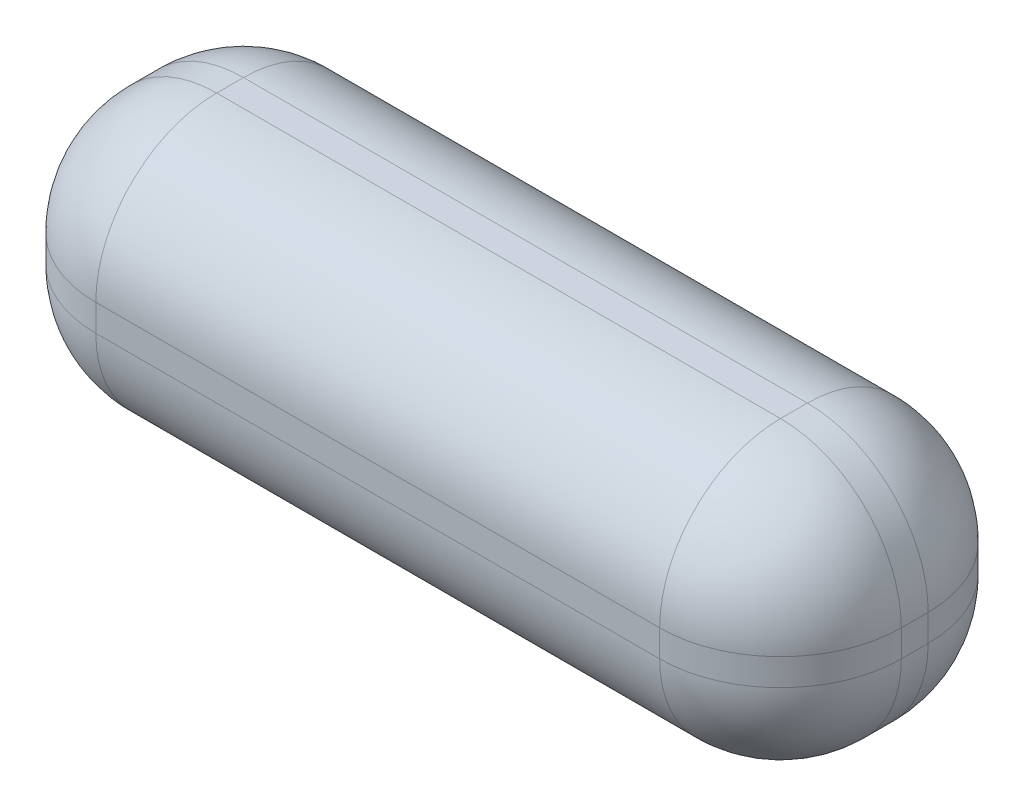
ISO-10303-21;
HEADER;
FILE_DESCRIPTION(('STEP AP214'),'2;1');
FILE_NAME('part.step','',(''),(''),'','','');
FILE_SCHEMA(('AUTOMOTIVE_DESIGN { 1 0 10303 214 1 1 1 1 }'));
ENDSEC;
DATA;
#1=APPLICATION_CONTEXT('core data for automotive mechanical design processes');
#2=APPLICATION_PROTOCOL_DEFINITION('international standard','automotive_design',2000,#1);
#3=PRODUCT_CONTEXT('',#1,'mechanical');
#4=PRODUCT('Part','Part','',(#3));
#5=PRODUCT_RELATED_PRODUCT_CATEGORY('part','',(#4));
#6=PRODUCT_DEFINITION_FORMATION('','',#4);
#7=PRODUCT_DEFINITION_CONTEXT('part definition',#1,'design');
#8=PRODUCT_DEFINITION('design','',#6,#7);
#9=PRODUCT_DEFINITION_SHAPE('','',#8);
#10=(LENGTH_UNIT() NAMED_UNIT(*) SI_UNIT(.MILLI.,.METRE.));
#11=(NAMED_UNIT(*) PLANE_ANGLE_UNIT() SI_UNIT($,.RADIAN.));
#12=(NAMED_UNIT(*) SI_UNIT($,.STERADIAN.) SOLID_ANGLE_UNIT());
#13=UNCERTAINTY_MEASURE_WITH_UNIT(LENGTH_MEASURE(1.E-05),#10,'distance_accuracy_value','');
#14=(GEOMETRIC_REPRESENTATION_CONTEXT(3) GLOBAL_UNCERTAINTY_ASSIGNED_CONTEXT((#13)) GLOBAL_UNIT_ASSIGNED_CONTEXT((#10,
#11,#12)) REPRESENTATION_CONTEXT('',''));
#15=CARTESIAN_POINT('',(0.,0.,0.));
#16=DIRECTION('',(0.,0.,1.));
#17=DIRECTION('',(1.,0.,0.));
#18=AXIS2_PLACEMENT_3D('',#15,#16,#17);
#19=CARTESIAN_POINT('',(-150.,-50.,50.));
#20=DIRECTION('',(1.,0.,0.));
#21=DIRECTION('',(0.,0.,-1.));
#22=AXIS2_PLACEMENT_3D('',#19,#20,#21);
#23=PLANE('',#22);
#24=DIRECTION('',(0.,-1.,0.));
#25=VECTOR('',#24,1.);
#26=CARTESIAN_POINT('',(-150.,-50.,-5.));
#27=LINE('',#26,#25);
#28=CARTESIAN_POINT('',(-150.,5.,-5.));
#29=VERTEX_POINT('',#28);
#30=CARTESIAN_POINT('',(-150.,-5.00000000000001,-5.));
#31=VERTEX_POINT('',#30);
#32=EDGE_CURVE('E186',#29,#31,#27,.T.);
#33=ORIENTED_EDGE('',*,*,#32,.T.);
#34=DIRECTION('',(0.,0.,-1.));
#35=VECTOR('',#34,1.);
#36=CARTESIAN_POINT('',(-150.,-5.00000000000001,50.));
#37=LINE('',#36,#35);
#38=CARTESIAN_POINT('',(-150.,-5.00000000000001,5.));
#39=VERTEX_POINT('',#38);
#40=EDGE_CURVE('E189',#31,#39,#37,.F.);
#41=ORIENTED_EDGE('',*,*,#40,.T.);
#42=DIRECTION('',(0.,-1.,0.));
#43=VECTOR('',#42,1.);
#44=CARTESIAN_POINT('',(-150.,50.,5.));
#45=LINE('',#44,#43);
#46=CARTESIAN_POINT('',(-150.,5.,5.));
#47=VERTEX_POINT('',#46);
#48=EDGE_CURVE('E183',#39,#47,#45,.F.);
#49=ORIENTED_EDGE('',*,*,#48,.T.);
#50=DIRECTION('',(0.,0.,-1.));
#51=VECTOR('',#50,1.);
#52=CARTESIAN_POINT('',(-150.,5.,50.));
#53=LINE('',#52,#51);
#54=EDGE_CURVE('E180',#47,#29,#53,.T.);
#55=ORIENTED_EDGE('',*,*,#54,.T.);
#56=EDGE_LOOP('',(#33,#41,#49,#55));
#57=FACE_BOUND('',#56,.T.);
#58=ADVANCED_FACE('F40',(#57),#23,.F.);
#59=CARTESIAN_POINT('',(150.,-50.,50.));
#60=DIRECTION('',(0.,1.,0.));
#61=DIRECTION('',(-1.,0.,0.));
#62=AXIS2_PLACEMENT_3D('',#59,#60,#61);
#63=PLANE('',#62);
#64=DIRECTION('',(1.,0.,0.));
#65=VECTOR('',#64,1.);
#66=CARTESIAN_POINT('',(-150.,-50.,5.));
#67=LINE('',#66,#65);
#68=CARTESIAN_POINT('',(105.,-50.,5.));
#69=VERTEX_POINT('',#68);
#70=CARTESIAN_POINT('',(-105.,-50.,5.));
#71=VERTEX_POINT('',#70);
#72=EDGE_CURVE('E133',#69,#71,#67,.F.);
#73=ORIENTED_EDGE('',*,*,#72,.T.);
#74=DIRECTION('',(0.,0.,-1.));
#75=VECTOR('',#74,1.);
#76=CARTESIAN_POINT('',(-105.,-50.,50.));
#77=LINE('',#76,#75);
#78=CARTESIAN_POINT('',(-105.,-50.,-5.));
#79=VERTEX_POINT('',#78);
#80=EDGE_CURVE('E177',#71,#79,#77,.T.);
#81=ORIENTED_EDGE('',*,*,#80,.T.);
#82=DIRECTION('',(1.,0.,0.));
#83=VECTOR('',#82,1.);
#84=CARTESIAN_POINT('',(150.,-50.,-5.));
#85=LINE('',#84,#83);
#86=CARTESIAN_POINT('',(105.,-50.,-5.));
#87=VERTEX_POINT('',#86);
#88=EDGE_CURVE('E136',#79,#87,#85,.T.);
#89=ORIENTED_EDGE('',*,*,#88,.T.);
#90=DIRECTION('',(0.,0.,-1.));
#91=VECTOR('',#90,1.);
#92=CARTESIAN_POINT('',(105.,-50.,50.));
#93=LINE('',#92,#91);
#94=EDGE_CURVE('E128',#87,#69,#93,.F.);
#95=ORIENTED_EDGE('',*,*,#94,.T.);
#96=EDGE_LOOP('',(#73,#81,#89,#95));
#97=FACE_BOUND('',#96,.T.);
#98=ADVANCED_FACE('F130',(#97),#63,.F.);
#99=CARTESIAN_POINT('',(150.,-50.,50.));
#100=DIRECTION('',(-1.,0.,0.));
#101=DIRECTION('',(0.,0.,1.));
#102=AXIS2_PLACEMENT_3D('',#99,#100,#101);
#103=PLANE('',#102);
#104=DIRECTION('',(0.,1.,0.));
#105=VECTOR('',#104,1.);
#106=CARTESIAN_POINT('',(150.,-50.,5.));
#107=LINE('',#106,#105);
#108=CARTESIAN_POINT('',(150.,5.00000000000001,5.));
#109=VERTEX_POINT('',#108);
#110=CARTESIAN_POINT('',(150.,-5.,5.));
#111=VERTEX_POINT('',#110);
#112=EDGE_CURVE('E209',#109,#111,#107,.F.);
#113=ORIENTED_EDGE('',*,*,#112,.T.);
#114=DIRECTION('',(0.,0.,-1.));
#115=VECTOR('',#114,1.);
#116=CARTESIAN_POINT('',(150.,-5.,50.));
#117=LINE('',#116,#115);
#118=CARTESIAN_POINT('',(150.,-5.,-5.));
#119=VERTEX_POINT('',#118);
#120=EDGE_CURVE('E148',#111,#119,#117,.T.);
#121=ORIENTED_EDGE('',*,*,#120,.T.);
#122=DIRECTION('',(0.,1.,0.));
#123=VECTOR('',#122,1.);
#124=CARTESIAN_POINT('',(150.,-50.,-5.));
#125=LINE('',#124,#123);
#126=CARTESIAN_POINT('',(150.,5.00000000000001,-5.));
#127=VERTEX_POINT('',#126);
#128=EDGE_CURVE('E212',#119,#127,#125,.T.);
#129=ORIENTED_EDGE('',*,*,#128,.T.);
#130=DIRECTION('',(0.,0.,-1.));
#131=VECTOR('',#130,1.);
#132=CARTESIAN_POINT('',(150.,5.00000000000001,50.));
#133=LINE('',#132,#131);
#134=EDGE_CURVE('E206',#127,#109,#133,.F.);
#135=ORIENTED_EDGE('',*,*,#134,.T.);
#136=EDGE_LOOP('',(#113,#121,#129,#135));
#137=FACE_BOUND('',#136,.T.);
#138=ADVANCED_FACE('F387',(#137),#103,.F.);
#139=CARTESIAN_POINT('',(150.,50.,50.));
#140=DIRECTION('',(0.,-1.,0.));
#141=DIRECTION('',(1.,0.,0.));
#142=AXIS2_PLACEMENT_3D('',#139,#140,#141);
#143=PLANE('',#142);
#144=DIRECTION('',(-1.,0.,0.));
#145=VECTOR('',#144,1.);
#146=CARTESIAN_POINT('',(150.,50.,5.));
#147=LINE('',#146,#145);
#148=CARTESIAN_POINT('',(-105.,50.,5.));
#149=VERTEX_POINT('',#148);
#150=CARTESIAN_POINT('',(105.,50.,5.));
#151=VERTEX_POINT('',#150);
#152=EDGE_CURVE('E50',#149,#151,#147,.F.);
#153=ORIENTED_EDGE('',*,*,#152,.T.);
#154=DIRECTION('',(0.,0.,-1.));
#155=VECTOR('',#154,1.);
#156=CARTESIAN_POINT('',(105.,50.,50.));
#157=LINE('',#156,#155);
#158=CARTESIAN_POINT('',(105.,50.,-5.));
#159=VERTEX_POINT('',#158);
#160=EDGE_CURVE('E11',#151,#159,#157,.T.);
#161=ORIENTED_EDGE('',*,*,#160,.T.);
#162=DIRECTION('',(-1.,0.,0.));
#163=VECTOR('',#162,1.);
#164=CARTESIAN_POINT('',(150.,50.,-5.));
#165=LINE('',#164,#163);
#166=CARTESIAN_POINT('',(-105.,50.,-5.));
#167=VERTEX_POINT('',#166);
#168=EDGE_CURVE('E230',#159,#167,#165,.T.);
#169=ORIENTED_EDGE('',*,*,#168,.T.);
#170=DIRECTION('',(0.,0.,-1.));
#171=VECTOR('',#170,1.);
#172=CARTESIAN_POINT('',(-105.,50.,50.));
#173=LINE('',#172,#171);
#174=EDGE_CURVE('E61',#167,#149,#173,.F.);
#175=ORIENTED_EDGE('',*,*,#174,.T.);
#176=EDGE_LOOP('',(#153,#161,#169,#175));
#177=FACE_BOUND('',#176,.T.);
#178=ADVANCED_FACE('F327',(#177),#143,.F.);
#179=CARTESIAN_POINT('',(0.,0.,50.));
#180=DIRECTION('',(0.,0.,1.));
#181=DIRECTION('',(1.,0.,0.));
#182=AXIS2_PLACEMENT_3D('',#179,#180,#181);
#183=PLANE('',#182);
#184=DIRECTION('',(1.,0.,0.));
#185=VECTOR('',#184,1.);
#186=CARTESIAN_POINT('',(150.,-4.99999999999999,50.));
#187=LINE('',#186,#185);
#188=CARTESIAN_POINT('',(-105.,-5.00000000000001,50.));
#189=VERTEX_POINT('',#188);
#190=CARTESIAN_POINT('',(105.,-4.99999999999999,50.));
#191=VERTEX_POINT('',#190);
#192=EDGE_CURVE('E223',#189,#191,#187,.T.);
#193=ORIENTED_EDGE('',*,*,#192,.T.);
#194=DIRECTION('',(0.,1.,0.));
#195=VECTOR('',#194,1.);
#196=CARTESIAN_POINT('',(105.,50.,50.));
#197=LINE('',#196,#195);
#198=CARTESIAN_POINT('',(105.,5.00000000000001,50.));
#199=VERTEX_POINT('',#198);
#200=EDGE_CURVE('E226',#191,#199,#197,.T.);
#201=ORIENTED_EDGE('',*,*,#200,.T.);
#202=DIRECTION('',(-1.,0.,0.));
#203=VECTOR('',#202,1.);
#204=CARTESIAN_POINT('',(-150.,4.99999999999999,50.));
#205=LINE('',#204,#203);
#206=CARTESIAN_POINT('',(-105.,4.99999999999999,50.));
#207=VERTEX_POINT('',#206);
#208=EDGE_CURVE('E217',#199,#207,#205,.T.);
#209=ORIENTED_EDGE('',*,*,#208,.T.);
#210=DIRECTION('',(0.,-1.,0.));
#211=VECTOR('',#210,1.);
#212=CARTESIAN_POINT('',(-105.,-50.,50.));
#213=LINE('',#212,#211);
#214=EDGE_CURVE('E220',#207,#189,#213,.T.);
#215=ORIENTED_EDGE('',*,*,#214,.T.);
#216=EDGE_LOOP('',(#193,#201,#209,#215));
#217=FACE_BOUND('',#216,.T.);
#218=ADVANCED_FACE('F351',(#217),#183,.T.);
#219=CARTESIAN_POINT('',(0.,0.,-50.));
#220=DIRECTION('',(0.,0.,1.));
#221=DIRECTION('',(1.,0.,0.));
#222=AXIS2_PLACEMENT_3D('',#219,#220,#221);
#223=PLANE('',#222);
#224=DIRECTION('',(0.,1.,0.));
#225=VECTOR('',#224,1.);
#226=CARTESIAN_POINT('',(105.,0.,-50.));
#227=LINE('',#226,#225);
#228=CARTESIAN_POINT('',(105.,5.00000000000001,-50.));
#229=VERTEX_POINT('',#228);
#230=CARTESIAN_POINT('',(105.,-4.99999999999999,-50.));
#231=VERTEX_POINT('',#230);
#232=EDGE_CURVE('E196',#229,#231,#227,.F.);
#233=ORIENTED_EDGE('',*,*,#232,.T.);
#234=DIRECTION('',(1.,0.,0.));
#235=VECTOR('',#234,1.);
#236=CARTESIAN_POINT('',(0.,-5.,-50.));
#237=LINE('',#236,#235);
#238=CARTESIAN_POINT('',(-105.,-5.00000000000001,-50.));
#239=VERTEX_POINT('',#238);
#240=EDGE_CURVE('E202',#231,#239,#237,.F.);
#241=ORIENTED_EDGE('',*,*,#240,.T.);
#242=DIRECTION('',(0.,-1.,0.));
#243=VECTOR('',#242,1.);
#244=CARTESIAN_POINT('',(-105.,0.,-50.));
#245=LINE('',#244,#243);
#246=CARTESIAN_POINT('',(-105.,4.99999999999999,-50.));
#247=VERTEX_POINT('',#246);
#248=EDGE_CURVE('E199',#239,#247,#245,.F.);
#249=ORIENTED_EDGE('',*,*,#248,.T.);
#250=DIRECTION('',(-1.,0.,0.));
#251=VECTOR('',#250,1.);
#252=CARTESIAN_POINT('',(0.,5.,-50.));
#253=LINE('',#252,#251);
#254=EDGE_CURVE('E193',#247,#229,#253,.F.);
#255=ORIENTED_EDGE('',*,*,#254,.T.);
#256=EDGE_LOOP('',(#233,#241,#249,#255));
#257=FACE_BOUND('',#256,.T.);
#258=ADVANCED_FACE('F320',(#257),#223,.F.);
#259=CARTESIAN_POINT('',(105.,5.00000000000001,50.));
#260=DIRECTION('',(0.,0.,-1.));
#261=DIRECTION('',(-1.,0.,0.));
#262=AXIS2_PLACEMENT_3D('',#259,#260,#261);
#263=CYLINDRICAL_SURFACE('',#262,45.);
#264=CARTESIAN_POINT('',(105.,5.00000000000001,5.));
#265=DIRECTION('',(0.,0.,1.));
#266=DIRECTION('',(1.,0.,0.));
#267=AXIS2_PLACEMENT_3D('',#264,#265,#266);
#268=CIRCLE('',#267,45.);
#269=EDGE_CURVE('E44',#109,#151,#268,.T.);
#270=ORIENTED_EDGE('',*,*,#269,.F.);
#271=ORIENTED_EDGE('',*,*,#134,.F.);
#272=CARTESIAN_POINT('',(105.,5.00000000000001,-5.));
#273=DIRECTION('',(0.,0.,-1.));
#274=DIRECTION('',(-1.,0.,0.));
#275=AXIS2_PLACEMENT_3D('',#272,#273,#274);
#276=CIRCLE('',#275,45.);
#277=EDGE_CURVE('E173',#159,#127,#276,.T.);
#278=ORIENTED_EDGE('',*,*,#277,.F.);
#279=ORIENTED_EDGE('',*,*,#160,.F.);
#280=EDGE_LOOP('',(#270,#271,#278,#279));
#281=FACE_BOUND('',#280,.T.);
#282=ADVANCED_FACE('F42',(#281),#263,.T.);
#283=CARTESIAN_POINT('',(105.,5.00000000000001,5.));
#284=DIRECTION('',(0.,0.,1.));
#285=DIRECTION('',(1.,0.,0.));
#286=AXIS2_PLACEMENT_3D('',#283,#284,#285);
#287=SPHERICAL_SURFACE('',#286,45.);
#288=CARTESIAN_POINT('',(105.,5.00000000000001,5.));
#289=DIRECTION('',(0.,1.,0.));
#290=DIRECTION('',(0.,0.,1.));
#291=AXIS2_PLACEMENT_3D('',#288,#289,#290);
#292=CIRCLE('',#291,45.);
#293=EDGE_CURVE('E297',#109,#199,#292,.F.);
#294=ORIENTED_EDGE('',*,*,#293,.F.);
#295=ORIENTED_EDGE('',*,*,#269,.T.);
#296=CARTESIAN_POINT('',(105.,5.00000000000001,5.));
#297=DIRECTION('',(1.,0.,0.));
#298=DIRECTION('',(0.,0.,-1.));
#299=AXIS2_PLACEMENT_3D('',#296,#297,#298);
#300=CIRCLE('',#299,45.);
#301=EDGE_CURVE('E301',#199,#151,#300,.F.);
#302=ORIENTED_EDGE('',*,*,#301,.F.);
#303=EDGE_LOOP('',(#294,#295,#302));
#304=FACE_BOUND('',#303,.T.);
#305=ADVANCED_FACE('F344',(#304),#287,.T.);
#306=CARTESIAN_POINT('',(105.,5.00000000000001,-5.));
#307=DIRECTION('',(0.,0.,1.));
#308=DIRECTION('',(1.,0.,0.));
#309=AXIS2_PLACEMENT_3D('',#306,#307,#308);
#310=SPHERICAL_SURFACE('',#309,45.);
#311=CARTESIAN_POINT('',(105.,5.00000000000001,-5.));
#312=DIRECTION('',(1.,0.,0.));
#313=DIRECTION('',(0.,0.,-1.));
#314=AXIS2_PLACEMENT_3D('',#311,#312,#313);
#315=CIRCLE('',#314,45.);
#316=EDGE_CURVE('E289',#159,#229,#315,.F.);
#317=ORIENTED_EDGE('',*,*,#316,.F.);
#318=ORIENTED_EDGE('',*,*,#277,.T.);
#319=CARTESIAN_POINT('',(105.,5.00000000000001,-5.));
#320=DIRECTION('',(0.,1.,0.));
#321=DIRECTION('',(0.,0.,1.));
#322=AXIS2_PLACEMENT_3D('',#319,#320,#321);
#323=CIRCLE('',#322,45.);
#324=EDGE_CURVE('E293',#229,#127,#323,.F.);
#325=ORIENTED_EDGE('',*,*,#324,.F.);
#326=EDGE_LOOP('',(#317,#318,#325));
#327=FACE_BOUND('',#326,.T.);
#328=ADVANCED_FACE('F310',(#327),#310,.T.);
#329=CARTESIAN_POINT('',(0.,5.,5.));
#330=DIRECTION('',(1.,0.,0.));
#331=DIRECTION('',(0.,1.,0.));
#332=AXIS2_PLACEMENT_3D('',#329,#330,#331);
#333=CYLINDRICAL_SURFACE('',#332,45.);
#334=ORIENTED_EDGE('',*,*,#301,.T.);
#335=ORIENTED_EDGE('',*,*,#152,.F.);
#336=CARTESIAN_POINT('',(-105.,4.99999999999999,5.));
#337=DIRECTION('',(-1.,0.,0.));
#338=DIRECTION('',(0.,0.,1.));
#339=AXIS2_PLACEMENT_3D('',#336,#337,#338);
#340=CIRCLE('',#339,45.);
#341=EDGE_CURVE('E281',#207,#149,#340,.T.);
#342=ORIENTED_EDGE('',*,*,#341,.F.);
#343=ORIENTED_EDGE('',*,*,#208,.F.);
#344=EDGE_LOOP('',(#334,#335,#342,#343));
#345=FACE_BOUND('',#344,.T.);
#346=ADVANCED_FACE('F340',(#345),#333,.T.);
#347=CARTESIAN_POINT('',(105.,0.,5.));
#348=DIRECTION('',(0.,-1.,0.));
#349=DIRECTION('',(0.,0.,-1.));
#350=AXIS2_PLACEMENT_3D('',#347,#348,#349);
#351=CYLINDRICAL_SURFACE('',#350,45.);
#352=ORIENTED_EDGE('',*,*,#293,.T.);
#353=ORIENTED_EDGE('',*,*,#200,.F.);
#354=CARTESIAN_POINT('',(105.,-5.,5.));
#355=DIRECTION('',(0.,-1.,0.));
#356=DIRECTION('',(0.,0.,-1.));
#357=AXIS2_PLACEMENT_3D('',#354,#355,#356);
#358=CIRCLE('',#357,45.);
#359=EDGE_CURVE('E153',#111,#191,#358,.T.);
#360=ORIENTED_EDGE('',*,*,#359,.F.);
#361=ORIENTED_EDGE('',*,*,#112,.F.);
#362=EDGE_LOOP('',(#352,#353,#360,#361));
#363=FACE_BOUND('',#362,.T.);
#364=ADVANCED_FACE('F349',(#363),#351,.T.);
#365=CARTESIAN_POINT('',(105.,-5.,50.));
#366=DIRECTION('',(0.,0.,-1.));
#367=DIRECTION('',(-1.,0.,0.));
#368=AXIS2_PLACEMENT_3D('',#365,#366,#367);
#369=CYLINDRICAL_SURFACE('',#368,45.);
#370=CARTESIAN_POINT('',(105.,-5.,-5.));
#371=DIRECTION('',(0.,0.,-1.));
#372=DIRECTION('',(-1.,0.,0.));
#373=AXIS2_PLACEMENT_3D('',#370,#371,#372);
#374=CIRCLE('',#373,45.);
#375=EDGE_CURVE('E154',#119,#87,#374,.T.);
#376=ORIENTED_EDGE('',*,*,#375,.F.);
#377=ORIENTED_EDGE('',*,*,#120,.F.);
#378=CARTESIAN_POINT('',(105.,-5.,5.));
#379=DIRECTION('',(0.,0.,1.));
#380=DIRECTION('',(1.,0.,0.));
#381=AXIS2_PLACEMENT_3D('',#378,#379,#380);
#382=CIRCLE('',#381,45.);
#383=EDGE_CURVE('E144',#69,#111,#382,.T.);
#384=ORIENTED_EDGE('',*,*,#383,.F.);
#385=ORIENTED_EDGE('',*,*,#94,.F.);
#386=EDGE_LOOP('',(#376,#377,#384,#385));
#387=FACE_BOUND('',#386,.T.);
#388=ADVANCED_FACE('F146',(#387),#369,.T.);
#389=CARTESIAN_POINT('',(105.,-50.,-5.));
#390=DIRECTION('',(0.,1.,0.));
#391=DIRECTION('',(0.,0.,1.));
#392=AXIS2_PLACEMENT_3D('',#389,#390,#391);
#393=CYLINDRICAL_SURFACE('',#392,45.);
#394=ORIENTED_EDGE('',*,*,#324,.T.);
#395=ORIENTED_EDGE('',*,*,#128,.F.);
#396=CARTESIAN_POINT('',(105.,-4.99999999999999,-5.));
#397=DIRECTION('',(0.,-1.,0.));
#398=DIRECTION('',(1.,0.,0.));
#399=AXIS2_PLACEMENT_3D('',#396,#397,#398);
#400=CIRCLE('',#399,45.);
#401=EDGE_CURVE('E274',#231,#119,#400,.T.);
#402=ORIENTED_EDGE('',*,*,#401,.F.);
#403=ORIENTED_EDGE('',*,*,#232,.F.);
#404=EDGE_LOOP('',(#394,#395,#402,#403));
#405=FACE_BOUND('',#404,.T.);
#406=ADVANCED_FACE('F316',(#405),#393,.T.);
#407=CARTESIAN_POINT('',(150.,5.00000000000002,-5.));
#408=DIRECTION('',(-1.,0.,0.));
#409=DIRECTION('',(0.,-1.,0.));
#410=AXIS2_PLACEMENT_3D('',#407,#408,#409);
#411=CYLINDRICAL_SURFACE('',#410,45.);
#412=ORIENTED_EDGE('',*,*,#316,.T.);
#413=ORIENTED_EDGE('',*,*,#254,.F.);
#414=CARTESIAN_POINT('',(-105.,5.,-5.));
#415=DIRECTION('',(-1.,0.,0.));
#416=DIRECTION('',(0.,0.,1.));
#417=AXIS2_PLACEMENT_3D('',#414,#415,#416);
#418=CIRCLE('',#417,45.);
#419=EDGE_CURVE('E270',#167,#247,#418,.T.);
#420=ORIENTED_EDGE('',*,*,#419,.F.);
#421=ORIENTED_EDGE('',*,*,#168,.F.);
#422=EDGE_LOOP('',(#412,#413,#420,#421));
#423=FACE_BOUND('',#422,.T.);
#424=ADVANCED_FACE('F326',(#423),#411,.T.);
#425=CARTESIAN_POINT('',(-105.,5.,50.));
#426=DIRECTION('',(0.,0.,-1.));
#427=DIRECTION('',(-1.,0.,0.));
#428=AXIS2_PLACEMENT_3D('',#425,#426,#427);
#429=CYLINDRICAL_SURFACE('',#428,45.);
#430=CARTESIAN_POINT('',(-105.,5.,5.));
#431=DIRECTION('',(0.,0.,1.));
#432=DIRECTION('',(1.,0.,0.));
#433=AXIS2_PLACEMENT_3D('',#430,#431,#432);
#434=CIRCLE('',#433,45.);
#435=EDGE_CURVE('E285',#149,#47,#434,.T.);
#436=ORIENTED_EDGE('',*,*,#435,.F.);
#437=ORIENTED_EDGE('',*,*,#174,.F.);
#438=CARTESIAN_POINT('',(-105.,5.,-5.));
#439=DIRECTION('',(0.,0.,-1.));
#440=DIRECTION('',(-1.,0.,0.));
#441=AXIS2_PLACEMENT_3D('',#438,#439,#440);
#442=CIRCLE('',#441,45.);
#443=EDGE_CURVE('E266',#29,#167,#442,.T.);
#444=ORIENTED_EDGE('',*,*,#443,.F.);
#445=ORIENTED_EDGE('',*,*,#54,.F.);
#446=EDGE_LOOP('',(#436,#437,#444,#445));
#447=FACE_BOUND('',#446,.T.);
#448=ADVANCED_FACE('F331',(#447),#429,.T.);
#449=CARTESIAN_POINT('',(-105.,4.99999999999999,5.));
#450=DIRECTION('',(0.,0.,1.));
#451=DIRECTION('',(1.,0.,0.));
#452=AXIS2_PLACEMENT_3D('',#449,#450,#451);
#453=SPHERICAL_SURFACE('',#452,45.);
#454=ORIENTED_EDGE('',*,*,#341,.T.);
#455=ORIENTED_EDGE('',*,*,#435,.T.);
#456=CARTESIAN_POINT('',(-105.,5.,5.));
#457=DIRECTION('',(0.,1.,0.));
#458=DIRECTION('',(0.,0.,1.));
#459=AXIS2_PLACEMENT_3D('',#456,#457,#458);
#460=CIRCLE('',#459,45.);
#461=EDGE_CURVE('E162',#207,#47,#460,.F.);
#462=ORIENTED_EDGE('',*,*,#461,.F.);
#463=EDGE_LOOP('',(#454,#455,#462));
#464=FACE_BOUND('',#463,.T.);
#465=ADVANCED_FACE('F337',(#464),#453,.T.);
#466=CARTESIAN_POINT('',(105.,-4.99999999999999,5.));
#467=DIRECTION('',(0.,0.,1.));
#468=DIRECTION('',(1.,0.,0.));
#469=AXIS2_PLACEMENT_3D('',#466,#467,#468);
#470=SPHERICAL_SURFACE('',#469,45.);
#471=ORIENTED_EDGE('',*,*,#383,.T.);
#472=ORIENTED_EDGE('',*,*,#359,.T.);
#473=CARTESIAN_POINT('',(105.,-4.99999999999999,5.));
#474=DIRECTION('',(1.,0.,0.));
#475=DIRECTION('',(0.,0.,-1.));
#476=AXIS2_PLACEMENT_3D('',#473,#474,#475);
#477=CIRCLE('',#476,45.);
#478=EDGE_CURVE('E157',#69,#191,#477,.F.);
#479=ORIENTED_EDGE('',*,*,#478,.F.);
#480=EDGE_LOOP('',(#471,#472,#479));
#481=FACE_BOUND('',#480,.T.);
#482=ADVANCED_FACE('F158',(#481),#470,.T.);
#483=CARTESIAN_POINT('',(105.,-4.99999999999999,-5.));
#484=DIRECTION('',(0.,0.,1.));
#485=DIRECTION('',(1.,0.,0.));
#486=AXIS2_PLACEMENT_3D('',#483,#484,#485);
#487=SPHERICAL_SURFACE('',#486,45.);
#488=ORIENTED_EDGE('',*,*,#401,.T.);
#489=ORIENTED_EDGE('',*,*,#375,.T.);
#490=CARTESIAN_POINT('',(105.,-5.,-5.));
#491=DIRECTION('',(1.,0.,0.));
#492=DIRECTION('',(0.,0.,-1.));
#493=AXIS2_PLACEMENT_3D('',#490,#491,#492);
#494=CIRCLE('',#493,45.);
#495=EDGE_CURVE('E163',#231,#87,#494,.F.);
#496=ORIENTED_EDGE('',*,*,#495,.F.);
#497=EDGE_LOOP('',(#488,#489,#496));
#498=FACE_BOUND('',#497,.T.);
#499=ADVANCED_FACE('F370',(#498),#487,.T.);
#500=CARTESIAN_POINT('',(-105.,4.99999999999999,-5.));
#501=DIRECTION('',(0.,0.,1.));
#502=DIRECTION('',(1.,0.,0.));
#503=AXIS2_PLACEMENT_3D('',#500,#501,#502);
#504=SPHERICAL_SURFACE('',#503,45.);
#505=ORIENTED_EDGE('',*,*,#443,.T.);
#506=ORIENTED_EDGE('',*,*,#419,.T.);
#507=CARTESIAN_POINT('',(-105.,4.99999999999999,-5.));
#508=DIRECTION('',(0.,1.,0.));
#509=DIRECTION('',(-1.,0.,0.));
#510=AXIS2_PLACEMENT_3D('',#507,#508,#509);
#511=CIRCLE('',#510,45.);
#512=EDGE_CURVE('E256',#29,#247,#511,.F.);
#513=ORIENTED_EDGE('',*,*,#512,.F.);
#514=EDGE_LOOP('',(#505,#506,#513));
#515=FACE_BOUND('',#514,.T.);
#516=ADVANCED_FACE('F372',(#515),#504,.T.);
#517=CARTESIAN_POINT('',(-105.,0.,5.));
#518=DIRECTION('',(0.,1.,0.));
#519=DIRECTION('',(0.,0.,1.));
#520=AXIS2_PLACEMENT_3D('',#517,#518,#519);
#521=CYLINDRICAL_SURFACE('',#520,45.);
#522=ORIENTED_EDGE('',*,*,#461,.T.);
#523=ORIENTED_EDGE('',*,*,#48,.F.);
#524=CARTESIAN_POINT('',(-105.,-5.00000000000001,5.));
#525=DIRECTION('',(0.,-1.,0.));
#526=DIRECTION('',(0.,0.,-1.));
#527=AXIS2_PLACEMENT_3D('',#524,#525,#526);
#528=CIRCLE('',#527,45.);
#529=EDGE_CURVE('E252',#189,#39,#528,.T.);
#530=ORIENTED_EDGE('',*,*,#529,.F.);
#531=ORIENTED_EDGE('',*,*,#214,.F.);
#532=EDGE_LOOP('',(#522,#523,#530,#531));
#533=FACE_BOUND('',#532,.T.);
#534=ADVANCED_FACE('F355',(#533),#521,.T.);
#535=CARTESIAN_POINT('',(0.,-5.,5.));
#536=DIRECTION('',(-1.,0.,0.));
#537=DIRECTION('',(0.,-1.,0.));
#538=AXIS2_PLACEMENT_3D('',#535,#536,#537);
#539=CYLINDRICAL_SURFACE('',#538,45.);
#540=ORIENTED_EDGE('',*,*,#478,.T.);
#541=ORIENTED_EDGE('',*,*,#192,.F.);
#542=CARTESIAN_POINT('',(-105.,-5.00000000000001,5.));
#543=DIRECTION('',(-1.,0.,0.));
#544=DIRECTION('',(0.,0.,1.));
#545=AXIS2_PLACEMENT_3D('',#542,#543,#544);
#546=CIRCLE('',#545,45.);
#547=EDGE_CURVE('E167',#71,#189,#546,.T.);
#548=ORIENTED_EDGE('',*,*,#547,.F.);
#549=ORIENTED_EDGE('',*,*,#72,.F.);
#550=EDGE_LOOP('',(#540,#541,#548,#549));
#551=FACE_BOUND('',#550,.T.);
#552=ADVANCED_FACE('F165',(#551),#539,.T.);
#553=CARTESIAN_POINT('',(150.,-4.99999999999999,-5.));
#554=DIRECTION('',(1.,0.,0.));
#555=DIRECTION('',(0.,1.,0.));
#556=AXIS2_PLACEMENT_3D('',#553,#554,#555);
#557=CYLINDRICAL_SURFACE('',#556,45.);
#558=ORIENTED_EDGE('',*,*,#495,.T.);
#559=ORIENTED_EDGE('',*,*,#88,.F.);
#560=CARTESIAN_POINT('',(-105.,-5.00000000000001,-5.));
#561=DIRECTION('',(-1.,0.,0.));
#562=DIRECTION('',(0.,-1.,0.));
#563=AXIS2_PLACEMENT_3D('',#560,#561,#562);
#564=CIRCLE('',#563,45.);
#565=EDGE_CURVE('E246',#239,#79,#564,.T.);
#566=ORIENTED_EDGE('',*,*,#565,.F.);
#567=ORIENTED_EDGE('',*,*,#240,.F.);
#568=EDGE_LOOP('',(#558,#559,#566,#567));
#569=FACE_BOUND('',#568,.T.);
#570=ADVANCED_FACE('F368',(#569),#557,.T.);
#571=CARTESIAN_POINT('',(-105.,-50.,-5.));
#572=DIRECTION('',(0.,-1.,0.));
#573=DIRECTION('',(0.,0.,-1.));
#574=AXIS2_PLACEMENT_3D('',#571,#572,#573);
#575=CYLINDRICAL_SURFACE('',#574,45.);
#576=ORIENTED_EDGE('',*,*,#512,.T.);
#577=ORIENTED_EDGE('',*,*,#248,.F.);
#578=CARTESIAN_POINT('',(-105.,-5.00000000000001,-5.));
#579=DIRECTION('',(0.,-1.,0.));
#580=DIRECTION('',(0.,0.,-1.));
#581=AXIS2_PLACEMENT_3D('',#578,#579,#580);
#582=CIRCLE('',#581,45.);
#583=EDGE_CURVE('E243',#31,#239,#582,.T.);
#584=ORIENTED_EDGE('',*,*,#583,.F.);
#585=ORIENTED_EDGE('',*,*,#32,.F.);
#586=EDGE_LOOP('',(#576,#577,#584,#585));
#587=FACE_BOUND('',#586,.T.);
#588=ADVANCED_FACE('F397',(#587),#575,.T.);
#589=CARTESIAN_POINT('',(-105.,-5.00000000000001,5.));
#590=DIRECTION('',(0.,0.,1.));
#591=DIRECTION('',(1.,0.,0.));
#592=AXIS2_PLACEMENT_3D('',#589,#590,#591);
#593=SPHERICAL_SURFACE('',#592,45.);
#594=ORIENTED_EDGE('',*,*,#547,.T.);
#595=ORIENTED_EDGE('',*,*,#529,.T.);
#596=CARTESIAN_POINT('',(-105.,-5.00000000000001,5.));
#597=DIRECTION('',(0.,0.,1.));
#598=DIRECTION('',(1.,0.,0.));
#599=AXIS2_PLACEMENT_3D('',#596,#597,#598);
#600=CIRCLE('',#599,45.);
#601=EDGE_CURVE('E240',#71,#39,#600,.F.);
#602=ORIENTED_EDGE('',*,*,#601,.F.);
#603=EDGE_LOOP('',(#594,#595,#602));
#604=FACE_BOUND('',#603,.T.);
#605=ADVANCED_FACE('F357',(#604),#593,.T.);
#606=CARTESIAN_POINT('',(-105.,-5.00000000000001,-5.));
#607=DIRECTION('',(0.,0.,1.));
#608=DIRECTION('',(1.,0.,0.));
#609=AXIS2_PLACEMENT_3D('',#606,#607,#608);
#610=SPHERICAL_SURFACE('',#609,45.);
#611=ORIENTED_EDGE('',*,*,#583,.T.);
#612=ORIENTED_EDGE('',*,*,#565,.T.);
#613=CARTESIAN_POINT('',(-105.,-5.00000000000001,-5.));
#614=DIRECTION('',(0.,0.,-1.));
#615=DIRECTION('',(-1.,0.,0.));
#616=AXIS2_PLACEMENT_3D('',#613,#614,#615);
#617=CIRCLE('',#616,45.);
#618=EDGE_CURVE('E237',#31,#79,#617,.F.);
#619=ORIENTED_EDGE('',*,*,#618,.F.);
#620=EDGE_LOOP('',(#611,#612,#619));
#621=FACE_BOUND('',#620,.T.);
#622=ADVANCED_FACE('F365',(#621),#610,.T.);
#623=CARTESIAN_POINT('',(-105.,-5.00000000000001,50.));
#624=DIRECTION('',(0.,0.,-1.));
#625=DIRECTION('',(-1.,0.,0.));
#626=AXIS2_PLACEMENT_3D('',#623,#624,#625);
#627=CYLINDRICAL_SURFACE('',#626,45.);
#628=ORIENTED_EDGE('',*,*,#601,.T.);
#629=ORIENTED_EDGE('',*,*,#40,.F.);
#630=ORIENTED_EDGE('',*,*,#618,.T.);
#631=ORIENTED_EDGE('',*,*,#80,.F.);
#632=EDGE_LOOP('',(#628,#629,#630,#631));
#633=FACE_BOUND('',#632,.T.);
#634=ADVANCED_FACE('F361',(#633),#627,.T.);
#635=CLOSED_SHELL('',(#58,#98,#138,#178,#218,#258,#282,#305,#328,#346,#364,#388,#406,#424,#448,
#465,#482,#499,#516,#534,#552,#570,#588,#605,#622,#634));
#636=MANIFOLD_SOLID_BREP('B2',#635);
#637=ADVANCED_BREP_SHAPE_REPRESENTATION('',(#18,#636),#14);
#638=SHAPE_DEFINITION_REPRESENTATION(#9,#637);
ENDSEC;
END-ISO-10303-21;
